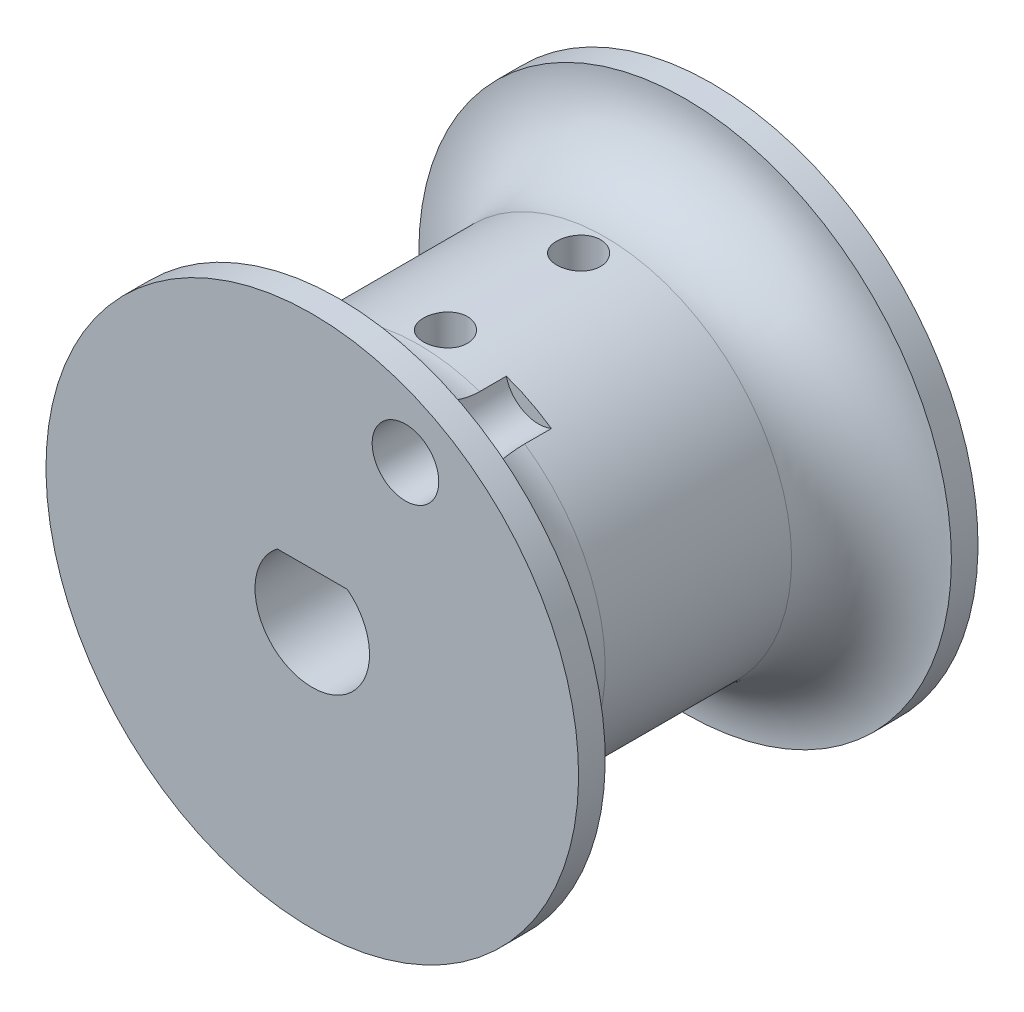
ISO-10303-21;
HEADER;
FILE_DESCRIPTION(('STEP AP214'),'2;1');
FILE_NAME('part.step','',(''),(''),'','','');
FILE_SCHEMA(('AUTOMOTIVE_DESIGN { 1 0 10303 214 1 1 1 1 }'));
ENDSEC;
DATA;
#1=APPLICATION_CONTEXT('core data for automotive mechanical design processes');
#2=APPLICATION_PROTOCOL_DEFINITION('international standard','automotive_design',2000,#1);
#3=PRODUCT_CONTEXT('',#1,'mechanical');
#4=PRODUCT('Part','Part','',(#3));
#5=PRODUCT_RELATED_PRODUCT_CATEGORY('part','',(#4));
#6=PRODUCT_DEFINITION_FORMATION('','',#4);
#7=PRODUCT_DEFINITION_CONTEXT('part definition',#1,'design');
#8=PRODUCT_DEFINITION('design','',#6,#7);
#9=PRODUCT_DEFINITION_SHAPE('','',#8);
#10=(LENGTH_UNIT() NAMED_UNIT(*) SI_UNIT(.MILLI.,.METRE.));
#11=(NAMED_UNIT(*) PLANE_ANGLE_UNIT() SI_UNIT($,.RADIAN.));
#12=(NAMED_UNIT(*) SI_UNIT($,.STERADIAN.) SOLID_ANGLE_UNIT());
#13=UNCERTAINTY_MEASURE_WITH_UNIT(LENGTH_MEASURE(1.E-05),#10,'distance_accuracy_value','');
#14=(GEOMETRIC_REPRESENTATION_CONTEXT(3) GLOBAL_UNCERTAINTY_ASSIGNED_CONTEXT((#13)) GLOBAL_UNIT_ASSIGNED_CONTEXT((#10,
#11,#12)) REPRESENTATION_CONTEXT('',''));
#15=CARTESIAN_POINT('',(0.,0.,0.));
#16=DIRECTION('',(0.,0.,1.));
#17=DIRECTION('',(1.,0.,0.));
#18=AXIS2_PLACEMENT_3D('',#15,#16,#17);
#19=CARTESIAN_POINT('',(0.,0.,-15.));
#20=DIRECTION('',(0.,0.,-1.));
#21=DIRECTION('',(0.,1.,0.));
#22=AXIS2_PLACEMENT_3D('',#19,#20,#21);
#23=CYLINDRICAL_SURFACE('',#22,14.);
#24=DIRECTION('',(0.,0.,1.));
#25=VECTOR('',#24,1.);
#26=CARTESIAN_POINT('',(7.95628400608908,11.519442035726,9.99999999999999));
#27=LINE('',#26,#25);
#28=CARTESIAN_POINT('',(7.95628400608909,11.519442035726,6.99999999999999));
#29=VERTEX_POINT('',#28);
#30=CARTESIAN_POINT('',(7.95628400608909,11.519442035726,5.));
#31=VERTEX_POINT('',#30);
#32=EDGE_CURVE('E81',#29,#31,#27,.F.);
#33=ORIENTED_EDGE('',*,*,#32,.F.);
#34=CARTESIAN_POINT('',(0.,0.,6.99999999999999));
#35=DIRECTION('',(0.,0.,-1.));
#36=DIRECTION('',(0.,1.,0.));
#37=AXIS2_PLACEMENT_3D('',#34,#35,#36);
#38=CIRCLE('',#37,14.);
#39=CARTESIAN_POINT('',(4.57233201888489,13.232300627974,6.99999999999999));
#40=VERTEX_POINT('',#39);
#41=EDGE_CURVE('E87',#29,#40,#38,.T.);
#42=ORIENTED_EDGE('',*,*,#41,.T.);
#43=DIRECTION('',(0.,0.,1.));
#44=VECTOR('',#43,1.);
#45=CARTESIAN_POINT('',(4.57233201888489,13.232300627974,9.99999999999999));
#46=LINE('',#45,#44);
#47=CARTESIAN_POINT('',(4.57233201888489,13.232300627974,5.));
#48=VERTEX_POINT('',#47);
#49=EDGE_CURVE('E49',#48,#40,#46,.T.);
#50=ORIENTED_EDGE('',*,*,#49,.F.);
#51=CARTESIAN_POINT('',(0.,0.,5.));
#52=DIRECTION('',(0.,0.,1.));
#53=DIRECTION('',(1.,0.,0.));
#54=AXIS2_PLACEMENT_3D('',#51,#52,#53);
#55=CIRCLE('',#54,14.);
#56=EDGE_CURVE('E11',#48,#31,#55,.F.);
#57=ORIENTED_EDGE('',*,*,#56,.T.);
#58=EDGE_LOOP('',(#33,#42,#50,#57));
#59=FACE_BOUND('',#58,.T.);
#60=CARTESIAN_POINT('',(0.,0.,-6.99999999999999));
#61=DIRECTION('',(0.,0.,1.));
#62=DIRECTION('',(0.,-1.,0.));
#63=AXIS2_PLACEMENT_3D('',#60,#61,#62);
#64=CIRCLE('',#63,14.);
#65=CARTESIAN_POINT('',(0.,-14.,-6.99999999999999));
#66=VERTEX_POINT('',#65);
#67=EDGE_CURVE('E126',#66,#66,#64,.T.);
#68=ORIENTED_EDGE('',*,*,#67,.T.);
#69=EDGE_LOOP('',(#68));
#70=FACE_BOUND('',#69,.T.);
#71=CARTESIAN_POINT('',(0.,14.,-3.35000000000001));
#72=CARTESIAN_POINT('',(0.0923377593117935,13.9999987732088,-3.35000394791192));
#73=CARTESIAN_POINT('',(0.184734253174178,13.9990768057287,-3.35777727023262));
#74=CARTESIAN_POINT('',(0.366959085022538,13.9954875686259,-3.38866552438654));
#75=CARTESIAN_POINT('',(0.456784590074963,13.9928184456852,-3.41179674768804));
#76=CARTESIAN_POINT('',(0.631202759590065,13.9860357754588,-3.47271235446148));
#77=CARTESIAN_POINT('',(0.715798793806195,13.9819231699762,-3.51048718535733));
#78=CARTESIAN_POINT('',(0.877433639422637,13.9727116945774,-3.59959751945974));
#79=CARTESIAN_POINT('',(0.954473807028015,13.9676130021443,-3.65093058296351));
#80=CARTESIAN_POINT('',(1.0992058142142,13.9569711521864,-3.76597046956199));
#81=CARTESIAN_POINT('',(1.16685515749544,13.9514261428222,-3.82973059135421));
#82=CARTESIAN_POINT('',(1.29051941447573,13.9405316626534,-3.9677004056232));
#83=CARTESIAN_POINT('',(1.34653375276669,13.9351822015305,-4.04191061460367));
#84=CARTESIAN_POINT('',(1.44549410254781,13.9252661174205,-4.19894739913753));
#85=CARTESIAN_POINT('',(1.48840067963765,13.9207018743925,-4.28179898839518));
#86=CARTESIAN_POINT('',(1.55967573099687,13.9128970701479,-4.45359427629809));
#87=CARTESIAN_POINT('',(1.58804469682894,13.9096564641758,-4.54253776884151));
#88=CARTESIAN_POINT('',(1.6293109650778,13.9048833039389,-4.7235530182552));
#89=CARTESIAN_POINT('',(1.64227968978843,13.9033428671017,-4.81560828146221));
#90=CARTESIAN_POINT('',(1.65259827812192,13.902120250686,-5.00060059628141));
#91=CARTESIAN_POINT('',(1.64994870253826,13.9024380043871,-5.09353761611348));
#92=CARTESIAN_POINT('',(1.62916460194495,13.9048886555224,-5.27715922799668));
#93=CARTESIAN_POINT('',(1.61110853669131,13.9070123557307,-5.36785284102958));
#94=CARTESIAN_POINT('',(1.56014631565139,13.9128212648079,-5.54491364691252));
#95=CARTESIAN_POINT('',(1.52723988963842,13.9165065020916,-5.63128076100304));
#96=CARTESIAN_POINT('',(1.44742600980835,13.9250337346909,-5.79748193432795));
#97=CARTESIAN_POINT('',(1.400484241173,13.9298785592063,-5.87729936367396));
#98=CARTESIAN_POINT('',(1.293956760353,13.9401768353472,-6.02795329394263));
#99=CARTESIAN_POINT('',(1.23437053383532,13.9456303117262,-6.09878942934987));
#100=CARTESIAN_POINT('',(1.10380969970066,13.9565723474086,-6.22992556197752));
#101=CARTESIAN_POINT('',(1.03276742285419,13.9620609165545,-6.29015820650558));
#102=CARTESIAN_POINT('',(0.881544717826916,13.9724233105021,-6.39785388945708));
#103=CARTESIAN_POINT('',(0.801364272359146,13.9772971341409,-6.44531690372325));
#104=CARTESIAN_POINT('',(0.634090942224887,13.9858834489544,-6.52612522550153));
#105=CARTESIAN_POINT('',(0.54699612159556,13.989595613427,-6.55946656239927));
#106=CARTESIAN_POINT('',(0.368390795390906,13.995437293359,-6.61103289230482));
#107=CARTESIAN_POINT('',(0.276880473638324,13.9975668746429,-6.62925851402491));
#108=CARTESIAN_POINT('',(0.0926244290919185,13.9999949200228,-6.64998933107842));
#109=CARTESIAN_POINT('',(-0.000110712485907713,14.0003041967917,-6.65258735691394));
#110=CARTESIAN_POINT('',(-0.184695060008294,13.9990859184675,-6.6422338562117));
#111=CARTESIAN_POINT('',(-0.276544282649117,13.9975583980598,-6.62928262329884));
#112=CARTESIAN_POINT('',(-0.456477458372104,13.9928449424618,-6.58827533203794));
#113=CARTESIAN_POINT('',(-0.544571580584271,13.9896638410252,-6.56026329134603));
#114=CARTESIAN_POINT('',(-0.714811398638068,13.9819995795479,-6.48997514387278));
#115=CARTESIAN_POINT('',(-0.796956913052963,13.9775163798153,-6.44769860226042));
#116=CARTESIAN_POINT('',(-0.953383880240914,13.9677212702205,-6.34985520196581));
#117=CARTESIAN_POINT('',(-1.02762735416983,13.962405637131,-6.29422800368084));
#118=CARTESIAN_POINT('',(-1.16575694476263,13.9515526153684,-6.17134805826415));
#119=CARTESIAN_POINT('',(-1.22964269727419,13.9460152189072,-6.10409490256369));
#120=CARTESIAN_POINT('',(-1.34557056620759,13.935309656933,-5.95946436708342));
#121=CARTESIAN_POINT('',(-1.39755133208326,13.9301434942219,-5.88203764245678));
#122=CARTESIAN_POINT('',(-1.48777049629128,13.9207975662881,-5.71949847849806));
#123=CARTESIAN_POINT('',(-1.52600914394285,13.9166177831701,-5.63438617863818));
#124=CARTESIAN_POINT('',(-1.58755824405063,13.9097312064781,-5.45909366591859));
#125=CARTESIAN_POINT('',(-1.61090387377195,13.9070209441914,-5.36892594661575));
#126=CARTESIAN_POINT('',(-1.64211780309306,13.9033700992099,-5.18591634621171));
#127=CARTESIAN_POINT('',(-1.64998673668766,13.9024294440241,-5.09307457480975));
#128=CARTESIAN_POINT('',(-1.65001314893369,13.9024262607486,-4.90796245453179));
#129=CARTESIAN_POINT('',(-1.64226700372343,13.9033522119799,-4.81569210468132));
#130=CARTESIAN_POINT('',(-1.61148661075223,13.9069532058016,-4.63377413950734));
#131=CARTESIAN_POINT('',(-1.58845235597697,13.9096282491945,-4.54412652538718));
#132=CARTESIAN_POINT('',(-1.52777867869725,13.9164225691019,-4.37000785727875));
#133=CARTESIAN_POINT('',(-1.49014335246648,13.9205414405248,-4.2855353591213));
#134=CARTESIAN_POINT('',(-1.4013454127272,13.9297600431821,-4.12408961568268));
#135=CARTESIAN_POINT('',(-1.35018270448777,13.9348597812855,-4.04711642292359));
#136=CARTESIAN_POINT('',(-1.23542317011283,13.9455032412262,-3.90236106774376));
#137=CARTESIAN_POINT('',(-1.17175446685099,13.9510494146726,-3.83463606528948));
#138=CARTESIAN_POINT('',(-1.03393869293863,13.9619389183627,-3.71079316066112));
#139=CARTESIAN_POINT('',(-0.959789144165004,13.9672822002539,-3.6546780113093));
#140=CARTESIAN_POINT('',(-0.802830813231097,13.9771836369168,-3.55548848021185));
#141=CARTESIAN_POINT('',(-0.719993477064628,13.9817390635318,-3.51245903603291));
#142=CARTESIAN_POINT('',(-0.548263451866819,13.9895234112124,-3.44098152865717));
#143=CARTESIAN_POINT('',(-0.459377541714292,13.9927537896698,-3.41251743676733));
#144=CARTESIAN_POINT('',(-0.308348262292608,13.9967351217709,-3.37788015994082));
#145=CARTESIAN_POINT('',(-0.247161587576715,13.9979535658142,-3.36743989471708));
#146=CARTESIAN_POINT('',(-0.123992101220384,13.999586414324,-3.35349851097075));
#147=CARTESIAN_POINT('',(-0.0620092945919205,14.0000008238499,-3.34999734878522));
#148=CARTESIAN_POINT('',(0.,14.,-3.35000000000001));
#149=B_SPLINE_CURVE_WITH_KNOTS('',3,(#71,#72,#73,#74,#75,#76,#77,#78,#79,#80,#81,#82,#83,#84,
#85,#86,#87,#88,#89,#90,#91,#92,#93,#94,#95,#96,#97,#98,#99,#100,#101,#102,#103,#104,#105,#106,
#107,#108,#109,#110,#111,#112,#113,#114,#115,#116,#117,#118,#119,#120,#121,#122,#123,#124,#125,
#126,#127,#128,#129,#130,#131,#132,#133,#134,#135,#136,#137,#138,#139,#140,#141,#142,#143,#144,
#145,#146,#147,#148),.UNSPECIFIED.,.T.,.F.,(4,2,2,2,2,2,2,2,2,2,2,2,2,2,2,2,2,2,2,2,2,2,2,2,2,2,
2,2,2,2,2,2,2,2,2,2,2,2,4),(0.,0.276786798277717,0.553867678619077,0.830768112019351,
1.10761875315827,1.3856840067529,1.66376300876635,1.94267054836569,2.22156865659525,
2.4991681928413,2.7767577616097,3.05294204582356,3.32913135586637,3.60600151709497,
3.88288294260806,4.16146418484532,4.4400459540922,4.71870600070091,4.99735445634137,
5.27434604647917,5.55133240611992,5.82751359410642,6.10370320180525,6.38116539503765,
6.65863734105234,6.93750854157522,7.21637468236443,7.49457967922086,7.77277327931699,
8.04925512801574,8.32573710356687,8.60214156920218,8.8785479705219,9.15659210492993,
9.43470209125658,9.71375662103045,9.99250339642571,10.1783803576986,10.3642561493734),.UNSPECIFIED.);
#150=CARTESIAN_POINT('',(0.,14.,-3.35000000000001));
#151=VERTEX_POINT('',#150);
#152=EDGE_CURVE('E89',#151,#151,#149,.T.);
#153=ORIENTED_EDGE('',*,*,#152,.F.);
#154=EDGE_LOOP('',(#153));
#155=FACE_BOUND('',#154,.T.);
#156=CARTESIAN_POINT('',(0.,14.,6.64999999999999));
#157=CARTESIAN_POINT('',(0.0923377593117936,13.9999987732088,6.64999605208808));
#158=CARTESIAN_POINT('',(0.184734253174178,13.9990768057287,6.64222272976738));
#159=CARTESIAN_POINT('',(0.366959085022538,13.9954875686259,6.61133447561346));
#160=CARTESIAN_POINT('',(0.456784590074963,13.9928184456852,6.58820325231196));
#161=CARTESIAN_POINT('',(0.631202759590066,13.9860357754588,6.52728764553852));
#162=CARTESIAN_POINT('',(0.715798793806195,13.9819231699762,6.48951281464267));
#163=CARTESIAN_POINT('',(0.877433639422637,13.9727116945774,6.40040248054026));
#164=CARTESIAN_POINT('',(0.954473807028015,13.9676130021443,6.34906941703649));
#165=CARTESIAN_POINT('',(1.0992058142142,13.9569711521864,6.23402953043801));
#166=CARTESIAN_POINT('',(1.16685515749544,13.9514261428222,6.17026940864579));
#167=CARTESIAN_POINT('',(1.29051941447573,13.9405316626534,6.0322995943768));
#168=CARTESIAN_POINT('',(1.34653375276669,13.9351822015305,5.95808938539633));
#169=CARTESIAN_POINT('',(1.44549410254781,13.9252661174205,5.80105260086247));
#170=CARTESIAN_POINT('',(1.48840067963765,13.9207018743925,5.71820101160482));
#171=CARTESIAN_POINT('',(1.55967573099687,13.9128970701479,5.54640572370191));
#172=CARTESIAN_POINT('',(1.58804469682894,13.9096564641758,5.45746223115849));
#173=CARTESIAN_POINT('',(1.6293109650778,13.9048833039389,5.2764469817448));
#174=CARTESIAN_POINT('',(1.64227968978843,13.9033428671017,5.1843917185378));
#175=CARTESIAN_POINT('',(1.65259827812192,13.902120250686,4.99939940371859));
#176=CARTESIAN_POINT('',(1.64994870253826,13.9024380043871,4.90646238388652));
#177=CARTESIAN_POINT('',(1.62916460194495,13.9048886555224,4.72284077200332));
#178=CARTESIAN_POINT('',(1.61110853669131,13.9070123557307,4.63214715897042));
#179=CARTESIAN_POINT('',(1.56014631565139,13.9128212648079,4.45508635308748));
#180=CARTESIAN_POINT('',(1.52723988963842,13.9165065020916,4.36871923899696));
#181=CARTESIAN_POINT('',(1.44742600980835,13.9250337346909,4.20251806567205));
#182=CARTESIAN_POINT('',(1.40048424117301,13.9298785592063,4.12270063632604));
#183=CARTESIAN_POINT('',(1.293956760353,13.9401768353472,3.97204670605737));
#184=CARTESIAN_POINT('',(1.23437053383532,13.9456303117262,3.90121057065013));
#185=CARTESIAN_POINT('',(1.10380969970066,13.9565723474086,3.77007443802248));
#186=CARTESIAN_POINT('',(1.03276742285419,13.9620609165545,3.70984179349442));
#187=CARTESIAN_POINT('',(0.881544717826915,13.9724233105021,3.60214611054292));
#188=CARTESIAN_POINT('',(0.801364272359145,13.9772971341409,3.55468309627675));
#189=CARTESIAN_POINT('',(0.634090942224886,13.9858834489544,3.47387477449847));
#190=CARTESIAN_POINT('',(0.54699612159556,13.989595613427,3.44053343760074));
#191=CARTESIAN_POINT('',(0.368390795390905,13.995437293359,3.38896710769518));
#192=CARTESIAN_POINT('',(0.276880473638324,13.9975668746429,3.37074148597509));
#193=CARTESIAN_POINT('',(0.0926244290919171,13.9999949200228,3.35001066892158));
#194=CARTESIAN_POINT('',(-0.000110712485909434,14.0003041967917,3.34741264308606));
#195=CARTESIAN_POINT('',(-0.184695060008296,13.9990859184675,3.35776614378831));
#196=CARTESIAN_POINT('',(-0.276544282649118,13.9975583980598,3.37071737670116));
#197=CARTESIAN_POINT('',(-0.456477458372105,13.9928449424618,3.41172466796206));
#198=CARTESIAN_POINT('',(-0.544571580584272,13.9896638410252,3.43973670865397));
#199=CARTESIAN_POINT('',(-0.714811398638069,13.9819995795479,3.51002485612722));
#200=CARTESIAN_POINT('',(-0.796956913052963,13.9775163798153,3.55230139773958));
#201=CARTESIAN_POINT('',(-0.953383880240915,13.9677212702205,3.65014479803419));
#202=CARTESIAN_POINT('',(-1.02762735416983,13.962405637131,3.70577199631916));
#203=CARTESIAN_POINT('',(-1.16575694476263,13.9515526153684,3.82865194173586));
#204=CARTESIAN_POINT('',(-1.22964269727419,13.9460152189072,3.89590509743632));
#205=CARTESIAN_POINT('',(-1.3455705662076,13.935309656933,4.04053563291658));
#206=CARTESIAN_POINT('',(-1.39755133208326,13.9301434942219,4.11796235754322));
#207=CARTESIAN_POINT('',(-1.48777049629128,13.9207975662881,4.28050152150194));
#208=CARTESIAN_POINT('',(-1.52600914394285,13.9166177831701,4.36561382136182));
#209=CARTESIAN_POINT('',(-1.58755824405063,13.9097312064781,4.54090633408142));
#210=CARTESIAN_POINT('',(-1.61090387377195,13.9070209441914,4.63107405338425));
#211=CARTESIAN_POINT('',(-1.64211780309306,13.9033700992099,4.81408365378829));
#212=CARTESIAN_POINT('',(-1.64998673668766,13.9024294440241,4.90692542519025));
#213=CARTESIAN_POINT('',(-1.65001314893369,13.9024262607486,5.09203754546821));
#214=CARTESIAN_POINT('',(-1.64226700372343,13.9033522119799,5.18430789531868));
#215=CARTESIAN_POINT('',(-1.61148661075223,13.9069532058016,5.36622586049266));
#216=CARTESIAN_POINT('',(-1.58845235597697,13.9096282491945,5.45587347461282));
#217=CARTESIAN_POINT('',(-1.52777867869725,13.9164225691019,5.62999214272125));
#218=CARTESIAN_POINT('',(-1.49014335246648,13.9205414405248,5.7144646408787));
#219=CARTESIAN_POINT('',(-1.4013454127272,13.9297600431821,5.87591038431732));
#220=CARTESIAN_POINT('',(-1.35018270448777,13.9348597812855,5.95288357707642));
#221=CARTESIAN_POINT('',(-1.23542317011283,13.9455032412262,6.09763893225625));
#222=CARTESIAN_POINT('',(-1.17175446685098,13.9510494146726,6.16536393471052));
#223=CARTESIAN_POINT('',(-1.03393869293863,13.9619389183627,6.28920683933888));
#224=CARTESIAN_POINT('',(-0.959789144165004,13.9672822002539,6.3453219886907));
#225=CARTESIAN_POINT('',(-0.802830813231096,13.9771836369168,6.44451151978815));
#226=CARTESIAN_POINT('',(-0.719993477064627,13.9817390635318,6.48754096396709));
#227=CARTESIAN_POINT('',(-0.548263451866817,13.9895234112124,6.55901847134283));
#228=CARTESIAN_POINT('',(-0.459377541714291,13.9927537896698,6.58748256323267));
#229=CARTESIAN_POINT('',(-0.308348262292608,13.9967351217709,6.62211984005918));
#230=CARTESIAN_POINT('',(-0.247161587576715,13.9979535658142,6.63256010528292));
#231=CARTESIAN_POINT('',(-0.123992101220385,13.999586414324,6.64650148902925));
#232=CARTESIAN_POINT('',(-0.0620092945919206,14.0000008238499,6.65000265121478));
#233=CARTESIAN_POINT('',(0.,14.,6.64999999999999));
#234=B_SPLINE_CURVE_WITH_KNOTS('',3,(#156,#157,#158,#159,#160,#161,#162,#163,#164,#165,#166,
#167,#168,#169,#170,#171,#172,#173,#174,#175,#176,#177,#178,#179,#180,#181,#182,#183,#184,#185,
#186,#187,#188,#189,#190,#191,#192,#193,#194,#195,#196,#197,#198,#199,#200,#201,#202,#203,#204,
#205,#206,#207,#208,#209,#210,#211,#212,#213,#214,#215,#216,#217,#218,#219,#220,#221,#222,#223,
#224,#225,#226,#227,#228,#229,#230,#231,#232,#233),.UNSPECIFIED.,.T.,.F.,(4,2,2,2,2,2,2,2,2,2,2,
2,2,2,2,2,2,2,2,2,2,2,2,2,2,2,2,2,2,2,2,2,2,2,2,2,2,2,4),(0.,0.276786798277717,
0.553867678619077,0.830768112019351,1.10761875315827,1.3856840067529,1.66376300876636,
1.9426705483657,2.22156865659525,2.4991681928413,2.7767577616097,3.05294204582356,
3.32913135586637,3.60600151709497,3.88288294260807,4.16146418484532,4.4400459540922,
4.71870600070092,4.99735445634137,5.27434604647917,5.55133240611992,5.82751359410642,
6.10370320180526,6.38116539503765,6.65863734105234,6.93750854157522,7.21637468236443,
7.49457967922086,7.77277327931699,8.04925512801575,8.32573710356687,8.60214156920219,
8.87854797052191,9.15659210492994,9.43470209125659,9.71375662103045,9.99250339642572,
10.1783803576986,10.3642561493734),.UNSPECIFIED.);
#235=CARTESIAN_POINT('',(0.,14.,6.64999999999999));
#236=VERTEX_POINT('',#235);
#237=EDGE_CURVE('E96',#236,#236,#234,.T.);
#238=ORIENTED_EDGE('',*,*,#237,.F.);
#239=EDGE_LOOP('',(#238));
#240=FACE_BOUND('',#239,.T.);
#241=ADVANCED_FACE('F34',(#59,#70,#155,#240),#23,.T.);
#242=CARTESIAN_POINT('',(0.,0.,-15.));
#243=DIRECTION('',(0.,0.,-1.));
#244=DIRECTION('',(0.,1.,0.));
#245=AXIS2_PLACEMENT_3D('',#242,#243,#244);
#246=CYLINDRICAL_SURFACE('',#245,20.);
#247=CARTESIAN_POINT('',(0.,0.,-13.));
#248=DIRECTION('',(0.,0.,-1.));
#249=DIRECTION('',(0.,1.,0.));
#250=AXIS2_PLACEMENT_3D('',#247,#248,#249);
#251=CIRCLE('',#250,20.);
#252=CARTESIAN_POINT('',(0.,20.,-13.));
#253=VERTEX_POINT('',#252);
#254=EDGE_CURVE('E123',#253,#253,#251,.T.);
#255=ORIENTED_EDGE('',*,*,#254,.T.);
#256=EDGE_LOOP('',(#255));
#257=FACE_BOUND('',#256,.T.);
#258=CARTESIAN_POINT('',(0.,0.,-15.));
#259=DIRECTION('',(0.,0.,-1.));
#260=DIRECTION('',(0.,1.,0.));
#261=AXIS2_PLACEMENT_3D('',#258,#259,#260);
#262=CIRCLE('',#261,20.);
#263=CARTESIAN_POINT('',(0.,20.,-15.));
#264=VERTEX_POINT('',#263);
#265=EDGE_CURVE('E120',#264,#264,#262,.T.);
#266=ORIENTED_EDGE('',*,*,#265,.F.);
#267=EDGE_LOOP('',(#266));
#268=FACE_BOUND('',#267,.T.);
#269=ADVANCED_FACE('F166',(#257,#268),#246,.T.);
#270=CARTESIAN_POINT('',(0.,20.,-15.));
#271=DIRECTION('',(0.,0.,-1.));
#272=DIRECTION('',(0.,1.,0.));
#273=AXIS2_PLACEMENT_3D('',#270,#271,#272);
#274=PLANE('',#273);
#275=CARTESIAN_POINT('',(0.,0.,-15.));
#276=DIRECTION('',(0.,0.,1.));
#277=DIRECTION('',(1.,0.,0.));
#278=AXIS2_PLACEMENT_3D('',#275,#276,#277);
#279=CIRCLE('',#278,4.3);
#280=CARTESIAN_POINT('',(-2.63248931621764,3.4,-15.));
#281=VERTEX_POINT('',#280);
#282=CARTESIAN_POINT('',(2.63248931621764,3.4,-15.));
#283=VERTEX_POINT('',#282);
#284=EDGE_CURVE('E57',#281,#283,#279,.T.);
#285=ORIENTED_EDGE('',*,*,#284,.T.);
#286=DIRECTION('',(-1.,0.,0.));
#287=VECTOR('',#286,1.);
#288=CARTESIAN_POINT('',(-2.63248931621764,3.4,-15.));
#289=LINE('',#288,#287);
#290=EDGE_CURVE('E102',#283,#281,#289,.T.);
#291=ORIENTED_EDGE('',*,*,#290,.T.);
#292=EDGE_LOOP('',(#285,#291));
#293=FACE_BOUND('',#292,.T.);
#294=ORIENTED_EDGE('',*,*,#265,.T.);
#295=EDGE_LOOP('',(#294));
#296=FACE_BOUND('',#295,.T.);
#297=ADVANCED_FACE('F163',(#293,#296),#274,.T.);
#298=CARTESIAN_POINT('',(0.,0.,15.));
#299=DIRECTION('',(0.,0.,1.));
#300=DIRECTION('',(0.,1.,0.));
#301=AXIS2_PLACEMENT_3D('',#298,#299,#300);
#302=CYLINDRICAL_SURFACE('',#301,20.);
#303=CARTESIAN_POINT('',(0.,0.,13.));
#304=DIRECTION('',(0.,0.,-1.));
#305=DIRECTION('',(0.,1.,0.));
#306=AXIS2_PLACEMENT_3D('',#303,#304,#305);
#307=CIRCLE('',#306,20.);
#308=CARTESIAN_POINT('',(0.,20.,13.));
#309=VERTEX_POINT('',#308);
#310=EDGE_CURVE('E117',#309,#309,#307,.T.);
#311=ORIENTED_EDGE('',*,*,#310,.F.);
#312=EDGE_LOOP('',(#311));
#313=FACE_BOUND('',#312,.T.);
#314=CARTESIAN_POINT('',(0.,0.,15.));
#315=DIRECTION('',(0.,0.,-1.));
#316=DIRECTION('',(0.,1.,0.));
#317=AXIS2_PLACEMENT_3D('',#314,#315,#316);
#318=CIRCLE('',#317,20.);
#319=CARTESIAN_POINT('',(0.,20.,15.));
#320=VERTEX_POINT('',#319);
#321=EDGE_CURVE('E112',#320,#320,#318,.T.);
#322=ORIENTED_EDGE('',*,*,#321,.T.);
#323=EDGE_LOOP('',(#322));
#324=FACE_BOUND('',#323,.T.);
#325=ADVANCED_FACE('F159',(#313,#324),#302,.T.);
#326=CARTESIAN_POINT('',(0.,20.,15.));
#327=DIRECTION('',(0.,0.,1.));
#328=DIRECTION('',(0.,1.,0.));
#329=AXIS2_PLACEMENT_3D('',#326,#327,#328);
#330=PLANE('',#329);
#331=CARTESIAN_POINT('',(7.,13.8293166859393,15.));
#332=DIRECTION('',(0.,0.,1.));
#333=DIRECTION('',(1.,0.,0.));
#334=AXIS2_PLACEMENT_3D('',#331,#332,#333);
#335=CIRCLE('',#334,2.5);
#336=CARTESIAN_POINT('',(9.5,13.8293166859393,15.));
#337=VERTEX_POINT('',#336);
#338=EDGE_CURVE('E82',#337,#337,#335,.T.);
#339=ORIENTED_EDGE('',*,*,#338,.F.);
#340=EDGE_LOOP('',(#339));
#341=FACE_BOUND('',#340,.T.);
#342=CARTESIAN_POINT('',(0.,0.,15.));
#343=DIRECTION('',(0.,0.,1.));
#344=DIRECTION('',(1.,0.,0.));
#345=AXIS2_PLACEMENT_3D('',#342,#343,#344);
#346=CIRCLE('',#345,4.3);
#347=CARTESIAN_POINT('',(-2.63248931621764,3.4,15.));
#348=VERTEX_POINT('',#347);
#349=CARTESIAN_POINT('',(2.63248931621764,3.4,15.));
#350=VERTEX_POINT('',#349);
#351=EDGE_CURVE('E100',#348,#350,#346,.T.);
#352=ORIENTED_EDGE('',*,*,#351,.F.);
#353=DIRECTION('',(-1.,0.,0.));
#354=VECTOR('',#353,1.);
#355=CARTESIAN_POINT('',(-2.63248931621764,3.4,15.));
#356=LINE('',#355,#354);
#357=EDGE_CURVE('E103',#350,#348,#356,.T.);
#358=ORIENTED_EDGE('',*,*,#357,.F.);
#359=EDGE_LOOP('',(#352,#358));
#360=FACE_BOUND('',#359,.T.);
#361=ORIENTED_EDGE('',*,*,#321,.F.);
#362=EDGE_LOOP('',(#361));
#363=FACE_BOUND('',#362,.T.);
#364=ADVANCED_FACE('F156',(#341,#360,#363),#330,.T.);
#365=CARTESIAN_POINT('',(0.,0.,-15.));
#366=DIRECTION('',(0.,0.,1.));
#367=DIRECTION('',(1.,0.,0.));
#368=AXIS2_PLACEMENT_3D('',#365,#366,#367);
#369=CYLINDRICAL_SURFACE('',#368,4.3);
#370=ORIENTED_EDGE('',*,*,#351,.T.);
#371=DIRECTION('',(0.,0.,1.));
#372=VECTOR('',#371,1.);
#373=CARTESIAN_POINT('',(2.63248931621764,3.4,-15.));
#374=LINE('',#373,#372);
#375=EDGE_CURVE('E106',#283,#350,#374,.T.);
#376=ORIENTED_EDGE('',*,*,#375,.F.);
#377=ORIENTED_EDGE('',*,*,#284,.F.);
#378=DIRECTION('',(0.,0.,1.));
#379=VECTOR('',#378,1.);
#380=CARTESIAN_POINT('',(-2.63248931621764,3.4,-15.));
#381=LINE('',#380,#379);
#382=EDGE_CURVE('E110',#281,#348,#381,.T.);
#383=ORIENTED_EDGE('',*,*,#382,.T.);
#384=EDGE_LOOP('',(#370,#376,#377,#383));
#385=FACE_BOUND('',#384,.T.);
#386=ADVANCED_FACE('F152',(#385),#369,.F.);
#387=CARTESIAN_POINT('',(-2.63248931621764,3.4,-15.));
#388=DIRECTION('',(0.,1.,0.));
#389=DIRECTION('',(0.,0.,1.));
#390=AXIS2_PLACEMENT_3D('',#387,#388,#389);
#391=PLANE('',#390);
#392=CARTESIAN_POINT('',(0.,3.4,-5.));
#393=DIRECTION('',(0.,1.,0.));
#394=DIRECTION('',(0.,0.,1.));
#395=AXIS2_PLACEMENT_3D('',#392,#393,#394);
#396=CIRCLE('',#395,1.64999999999999);
#397=CARTESIAN_POINT('',(0.,3.4,-3.35000000000001));
#398=VERTEX_POINT('',#397);
#399=EDGE_CURVE('E93',#398,#398,#396,.T.);
#400=ORIENTED_EDGE('',*,*,#399,.T.);
#401=EDGE_LOOP('',(#400));
#402=FACE_BOUND('',#401,.T.);
#403=CARTESIAN_POINT('',(0.,3.4,5.));
#404=DIRECTION('',(0.,1.,0.));
#405=DIRECTION('',(0.,0.,1.));
#406=AXIS2_PLACEMENT_3D('',#403,#404,#405);
#407=CIRCLE('',#406,1.64999999999999);
#408=CARTESIAN_POINT('',(0.,3.4,6.64999999999999));
#409=VERTEX_POINT('',#408);
#410=EDGE_CURVE('E97',#409,#409,#407,.T.);
#411=ORIENTED_EDGE('',*,*,#410,.T.);
#412=EDGE_LOOP('',(#411));
#413=FACE_BOUND('',#412,.T.);
#414=ORIENTED_EDGE('',*,*,#357,.T.);
#415=ORIENTED_EDGE('',*,*,#382,.F.);
#416=ORIENTED_EDGE('',*,*,#290,.F.);
#417=ORIENTED_EDGE('',*,*,#375,.T.);
#418=EDGE_LOOP('',(#414,#415,#416,#417));
#419=FACE_BOUND('',#418,.T.);
#420=ADVANCED_FACE('F146',(#402,#413,#419),#391,.F.);
#421=CARTESIAN_POINT('',(0.,0.,5.));
#422=DIRECTION('',(0.,-1.,0.));
#423=DIRECTION('',(0.,0.,-1.));
#424=AXIS2_PLACEMENT_3D('',#421,#422,#423);
#425=CYLINDRICAL_SURFACE('',#424,1.64999999999999);
#426=ORIENTED_EDGE('',*,*,#237,.T.);
#427=EDGE_LOOP('',(#426));
#428=FACE_BOUND('',#427,.T.);
#429=ORIENTED_EDGE('',*,*,#410,.F.);
#430=EDGE_LOOP('',(#429));
#431=FACE_BOUND('',#430,.T.);
#432=ADVANCED_FACE('F141',(#428,#431),#425,.F.);
#433=CARTESIAN_POINT('',(0.,0.,-5.));
#434=DIRECTION('',(0.,-1.,0.));
#435=DIRECTION('',(0.,0.,-1.));
#436=AXIS2_PLACEMENT_3D('',#433,#434,#435);
#437=CYLINDRICAL_SURFACE('',#436,1.64999999999999);
#438=ORIENTED_EDGE('',*,*,#152,.T.);
#439=EDGE_LOOP('',(#438));
#440=FACE_BOUND('',#439,.T.);
#441=ORIENTED_EDGE('',*,*,#399,.F.);
#442=EDGE_LOOP('',(#441));
#443=FACE_BOUND('',#442,.T.);
#444=ADVANCED_FACE('F145',(#440,#443),#437,.F.);
#445=CARTESIAN_POINT('',(0.,0.,6.99999999999999));
#446=DIRECTION('',(0.,0.,-1.));
#447=DIRECTION('',(0.,1.,0.));
#448=AXIS2_PLACEMENT_3D('',#445,#446,#447);
#449=TOROIDAL_SURFACE('',#448,20.,6.);
#450=ORIENTED_EDGE('',*,*,#310,.T.);
#451=EDGE_LOOP('',(#450));
#452=FACE_BOUND('',#451,.T.);
#453=ORIENTED_EDGE('',*,*,#41,.F.);
#454=CARTESIAN_POINT('',(7.95628400975632,11.5194420372442,6.99979999999999));
#455=CARTESIAN_POINT('',(7.9562750581644,11.519444028855,7.07408368715527));
#456=CARTESIAN_POINT('',(7.95779709844106,11.5200678471327,7.1483573527101));
#457=CARTESIAN_POINT('',(7.96384604264571,11.5225837609455,7.29675232171218));
#458=CARTESIAN_POINT('',(7.96837259711349,11.5244757089825,7.37087364187337));
#459=CARTESIAN_POINT('',(7.98635668091046,11.532083598783,7.59262411195804));
#460=CARTESIAN_POINT('',(8.00421894403739,11.539731455485,7.73985377668178));
#461=CARTESIAN_POINT('',(8.05058210871556,11.5606355081342,8.03205971821158));
#462=CARTESIAN_POINT('',(8.07907440596762,11.5738871693324,8.17703771899509));
#463=CARTESIAN_POINT('',(8.1451675846482,11.606716773708,8.4642081881809));
#464=CARTESIAN_POINT('',(8.18277136568286,11.6262967314435,8.6063997542371));
#465=CARTESIAN_POINT('',(8.26666809702512,11.6734091991886,8.89185382533904));
#466=CARTESIAN_POINT('',(8.31319808955606,11.7011734730929,9.03500816755792));
#467=CARTESIAN_POINT('',(8.41216980676761,11.765518839907,9.31724393246079));
#468=CARTESIAN_POINT('',(8.46461196425772,11.8021005785368,9.45632505601813));
#469=CARTESIAN_POINT('',(8.57338792410376,11.8853167728379,9.72981008771555));
#470=CARTESIAN_POINT('',(8.62971937117147,11.9319451800786,9.86421675373761));
#471=CARTESIAN_POINT('',(8.74412585105388,12.0365434228732,10.127682756741));
#472=CARTESIAN_POINT('',(8.80220014936979,12.0945085360188,10.2567442932514));
#473=CARTESIAN_POINT('',(8.93885255344149,12.2466685641019,10.5547376152838));
#474=CARTESIAN_POINT('',(9.01719872379583,12.3463707868417,10.7210802727912));
#475=CARTESIAN_POINT('',(9.12806327627374,12.5155895208391,10.9594227509783));
#476=CARTESIAN_POINT('',(9.1638938557235,12.5752409507899,11.0369747739177));
#477=CARTESIAN_POINT('',(9.2322090602805,12.7013178726697,11.1879689654993));
#478=CARTESIAN_POINT('',(9.2646944068209,12.7677418978451,11.2614120187153));
#479=CARTESIAN_POINT('',(9.31889061306787,12.893145884036,11.3891801123516));
#480=CARTESIAN_POINT('',(9.34144932733403,12.9508942585318,11.4443565972957));
#481=CARTESIAN_POINT('',(9.38291215668322,13.0705437767624,11.5514773838522));
#482=CARTESIAN_POINT('',(9.40181717442208,13.1324438896953,11.6034224816318));
#483=CARTESIAN_POINT('',(9.43524603999049,13.260164419403,11.7038330064222));
#484=CARTESIAN_POINT('',(9.44976889999331,13.3259857160935,11.7522976469943));
#485=CARTESIAN_POINT('',(9.47368405021983,13.461090973663,11.8454669535934));
#486=CARTESIAN_POINT('',(9.48307896956049,13.5303731402129,11.8901735364267));
#487=CARTESIAN_POINT('',(9.49610784594523,13.67252010471,11.9760546496308));
#488=CARTESIAN_POINT('',(9.49968723696513,13.7454122970655,12.0171923354491));
#489=CARTESIAN_POINT('',(9.5002734020831,13.893381472849,12.0953042872179));
#490=CARTESIAN_POINT('',(9.49728350558921,13.9684573305349,12.1322806521999));
#491=CARTESIAN_POINT('',(9.48421365421085,14.1199271896976,12.2020321526689));
#492=CARTESIAN_POINT('',(9.47413526531519,14.1963208963998,12.2348082141959));
#493=CARTESIAN_POINT('',(9.44654218059159,14.3494051818047,12.2961888727554));
#494=CARTESIAN_POINT('',(9.42902868347901,14.4260957106785,12.32479414122));
#495=CARTESIAN_POINT('',(9.37110543731671,14.6331968375208,12.3969073566035));
#496=CARTESIAN_POINT('',(9.32327154813976,14.7629884115857,12.4365294390151));
#497=CARTESIAN_POINT('',(9.2053352223081,15.0150129569554,12.5048551035197));
#498=CARTESIAN_POINT('',(9.13523891293057,15.1372479969964,12.5335616851105));
#499=CARTESIAN_POINT('',(8.97914738927269,15.36249330081,12.5799568760261));
#500=CARTESIAN_POINT('',(8.89433707214749,15.4662128917086,12.5981965192006));
#501=CARTESIAN_POINT('',(8.70859069117572,15.6592506652701,12.6271392198717));
#502=CARTESIAN_POINT('',(8.60765622974839,15.748570277234,12.6378430257096));
#503=CARTESIAN_POINT('',(8.39288640991175,15.9096560954492,12.6523609828955));
#504=CARTESIAN_POINT('',(8.27910822800582,15.9814959303172,12.6562044810522));
#505=CARTESIAN_POINT('',(8.0414725519656,16.1060091763968,12.6573534586869));
#506=CARTESIAN_POINT('',(7.91761475176986,16.1586820053481,12.6546587395644));
#507=CARTESIAN_POINT('',(7.66305817203271,16.2435231426531,12.6425322751318));
#508=CARTESIAN_POINT('',(7.53234433973392,16.2756440989272,12.6330850771021));
#509=CARTESIAN_POINT('',(7.26818128531347,16.3184891183646,12.6068310720171));
#510=CARTESIAN_POINT('',(7.13473219649348,16.3292142217534,12.5900246228029));
#511=CARTESIAN_POINT('',(6.86936707631515,16.3294174769209,12.5481687384055));
#512=CARTESIAN_POINT('',(6.73744867966721,16.3189346108781,12.5231344974936));
#513=CARTESIAN_POINT('',(6.47895124424345,16.2779141189679,12.4637724709126));
#514=CARTESIAN_POINT('',(6.35237153669318,16.2473790130213,12.4294458533144));
#515=CARTESIAN_POINT('',(6.10823763295815,16.1683833124105,12.3505452709935));
#516=CARTESIAN_POINT('',(5.99069002453117,16.1199097810631,12.3059639196501));
#517=CARTESIAN_POINT('',(5.76788826618717,16.0081786718565,12.2060283061821));
#518=CARTESIAN_POINT('',(5.6626343431397,15.9449208212298,12.1506738452991));
#519=CARTESIAN_POINT('',(5.46327145503366,15.8051180932428,12.0271663877191));
#520=CARTESIAN_POINT('',(5.36965553976887,15.7281983105269,11.9586459769298));
#521=CARTESIAN_POINT('',(5.19880953475986,15.5669949853509,11.8107113283821));
#522=CARTESIAN_POINT('',(5.12158707943862,15.4827080376889,11.731292043247));
#523=CARTESIAN_POINT('',(5.00436341742055,15.3370731615382,11.5884364624531));
#524=CARTESIAN_POINT('',(4.96018881305607,15.2765565292188,11.527498400647));
#525=CARTESIAN_POINT('',(4.8792050217438,15.1550457098734,11.4013116749672));
#526=CARTESIAN_POINT('',(4.84239819999354,15.0940513760047,11.3360616357799));
#527=CARTESIAN_POINT('',(4.77560179434413,14.9725014230567,11.2016195160264));
#528=CARTESIAN_POINT('',(4.74562155410687,14.9119465138066,11.1324221927169));
#529=CARTESIAN_POINT('',(4.69190301209516,14.7921251772876,10.9905629752443));
#530=CARTESIAN_POINT('',(4.66816661941309,14.7328591491708,10.9179000294507));
#531=CARTESIAN_POINT('',(4.61710436404003,14.5907270135365,10.7370036349867));
#532=CARTESIAN_POINT('',(4.59275406247737,14.5088841357333,10.6271205714413));
#533=CARTESIAN_POINT('',(4.55358203416965,14.3505600962495,10.4019238169925));
#534=CARTESIAN_POINT('',(4.53876484969853,14.2740815059472,10.2866075653632));
#535=CARTESIAN_POINT('',(4.51671522239854,14.1273322541463,10.051051679093));
#536=CARTESIAN_POINT('',(4.50949951414317,14.0570756000813,9.93080178474899));
#537=CARTESIAN_POINT('',(4.50089263243021,13.9237587502116,9.68625929885354));
#538=CARTESIAN_POINT('',(4.49950072534486,13.8606976489522,9.56196721848672));
#539=CARTESIAN_POINT('',(4.50152728959366,13.6772692614456,9.17079046895653));
#540=CARTESIAN_POINT('',(4.51192207828128,13.5701762778711,8.89745889711451));
#541=CARTESIAN_POINT('',(4.53005444681129,13.4404092014195,8.47878043349728));
#542=CARTESIAN_POINT('',(4.53651313115335,13.4023248034237,8.33793955103057));
#543=CARTESIAN_POINT('',(4.54870058492511,13.3371373212463,8.05371931544244));
#544=CARTESIAN_POINT('',(4.55442970580491,13.3100289358056,7.91034122276659));
#545=CARTESIAN_POINT('',(4.56326803201407,13.27011860584,7.63936898534997));
#546=CARTESIAN_POINT('',(4.56661141994668,13.2559758572052,7.5119804958722));
#547=CARTESIAN_POINT('',(4.57001380514509,13.2417895046825,7.32029339710418));
#548=CARTESIAN_POINT('',(4.57087918755601,13.2382319932777,7.25625539499479));
#549=CARTESIAN_POINT('',(4.57204040586282,13.2334852377363,7.12808012403217));
#550=CARTESIAN_POINT('',(4.57233618374294,13.2322962348383,7.06394284573314));
#551=CARTESIAN_POINT('',(4.57233201793705,13.2323006318282,6.99979999999999));
#552=B_SPLINE_CURVE_WITH_KNOTS('',3,(#454,#455,#456,#457,#458,#459,#460,#461,#462,#463,#464,
#465,#466,#467,#468,#469,#470,#471,#472,#473,#474,#475,#476,#477,#478,#479,#480,#481,#482,#483,
#484,#485,#486,#487,#488,#489,#490,#491,#492,#493,#494,#495,#496,#497,#498,#499,#500,#501,#502,
#503,#504,#505,#506,#507,#508,#509,#510,#511,#512,#513,#514,#515,#516,#517,#518,#519,#520,#521,
#522,#523,#524,#525,#526,#527,#528,#529,#530,#531,#532,#533,#534,#535,#536,#537,#538,#539,#540,
#541,#542,#543,#544,#545,#546,#547,#548,#549,#550,#551),.UNSPECIFIED.,.F.,.F.,(4,2,2,2,2,2,2,2,
2,2,2,2,2,2,2,2,2,2,2,2,2,2,2,2,2,2,2,2,2,2,2,2,2,2,2,2,2,2,2,2,2,2,2,2,2,2,2,2,4),(0.,
0.222813329008757,0.445600746756176,0.890535802133225,1.33511149105922,1.77982884641614,
2.23860026396108,2.69740528843677,3.15593486490542,3.61427384195851,4.23946313118029,
4.55176675177153,4.86400287926682,5.11276777545052,5.36147113479537,5.61023051508228,
5.85886223528869,6.1098136236274,6.36063785558419,6.61140669288246,6.86213511565556,
7.29133656894433,7.72041999550671,8.1241368069395,8.52781352188208,8.92975922471563,
9.33171713694166,9.73459786760429,10.1374590104953,10.5395803307186,10.9416511269099,
11.3440124520179,11.7463812011911,12.1622640566795,12.5783401657067,12.8677046785406,
13.1571619344077,13.4470130254029,13.736952637299,14.1537857176559,14.5708172609678,
14.9887649885847,15.4066600654872,16.2842765400426,16.7220878676601,17.15968748562,
17.5439625248418,17.7363488335028,17.9287547361935),.UNSPECIFIED.);
#553=EDGE_CURVE('E42',#29,#40,#552,.T.);
#554=ORIENTED_EDGE('',*,*,#553,.T.);
#555=EDGE_LOOP('',(#453,#554));
#556=FACE_BOUND('',#555,.T.);
#557=ADVANCED_FACE('F179',(#452,#556),#449,.F.);
#558=CARTESIAN_POINT('',(0.,0.,-6.99999999999999));
#559=DIRECTION('',(0.,0.,1.));
#560=DIRECTION('',(0.,-1.,0.));
#561=AXIS2_PLACEMENT_3D('',#558,#559,#560);
#562=TOROIDAL_SURFACE('',#561,20.,6.);
#563=ORIENTED_EDGE('',*,*,#67,.F.);
#564=EDGE_LOOP('',(#563));
#565=FACE_BOUND('',#564,.T.);
#566=ORIENTED_EDGE('',*,*,#254,.F.);
#567=EDGE_LOOP('',(#566));
#568=FACE_BOUND('',#567,.T.);
#569=ADVANCED_FACE('F36',(#565,#568),#562,.F.);
#570=CARTESIAN_POINT('',(7.,13.8293166859393,5.));
#571=DIRECTION('',(0.,0.,1.));
#572=DIRECTION('',(1.,0.,0.));
#573=AXIS2_PLACEMENT_3D('',#570,#571,#572);
#574=CYLINDRICAL_SURFACE('',#573,2.5);
#575=ORIENTED_EDGE('',*,*,#32,.T.);
#576=CARTESIAN_POINT('',(7.,13.8293166859393,5.));
#577=DIRECTION('',(0.,0.,1.));
#578=DIRECTION('',(1.,0.,0.));
#579=AXIS2_PLACEMENT_3D('',#576,#577,#578);
#580=CIRCLE('',#579,2.5);
#581=EDGE_CURVE('E76',#48,#31,#580,.T.);
#582=ORIENTED_EDGE('',*,*,#581,.F.);
#583=ORIENTED_EDGE('',*,*,#49,.T.);
#584=ORIENTED_EDGE('',*,*,#553,.F.);
#585=EDGE_LOOP('',(#575,#582,#583,#584));
#586=FACE_BOUND('',#585,.T.);
#587=ORIENTED_EDGE('',*,*,#338,.T.);
#588=EDGE_LOOP('',(#587));
#589=FACE_BOUND('',#588,.T.);
#590=ADVANCED_FACE('F79',(#586,#589),#574,.F.);
#591=CARTESIAN_POINT('',(7.,13.8293166859393,5.));
#592=DIRECTION('',(0.,0.,1.));
#593=DIRECTION('',(1.,0.,0.));
#594=AXIS2_PLACEMENT_3D('',#591,#592,#593);
#595=PLANE('',#594);
#596=ORIENTED_EDGE('',*,*,#581,.T.);
#597=ORIENTED_EDGE('',*,*,#56,.F.);
#598=EDGE_LOOP('',(#596,#597));
#599=FACE_BOUND('',#598,.T.);
#600=ADVANCED_FACE('F75',(#599),#595,.T.);
#601=CLOSED_SHELL('',(#241,#269,#297,#325,#364,#386,#420,#432,#444,#557,#569,#590,#600));
#602=MANIFOLD_SOLID_BREP('B2',#601);
#603=ADVANCED_BREP_SHAPE_REPRESENTATION('',(#18,#602),#14);
#604=SHAPE_DEFINITION_REPRESENTATION(#9,#603);
ENDSEC;
END-ISO-10303-21;
